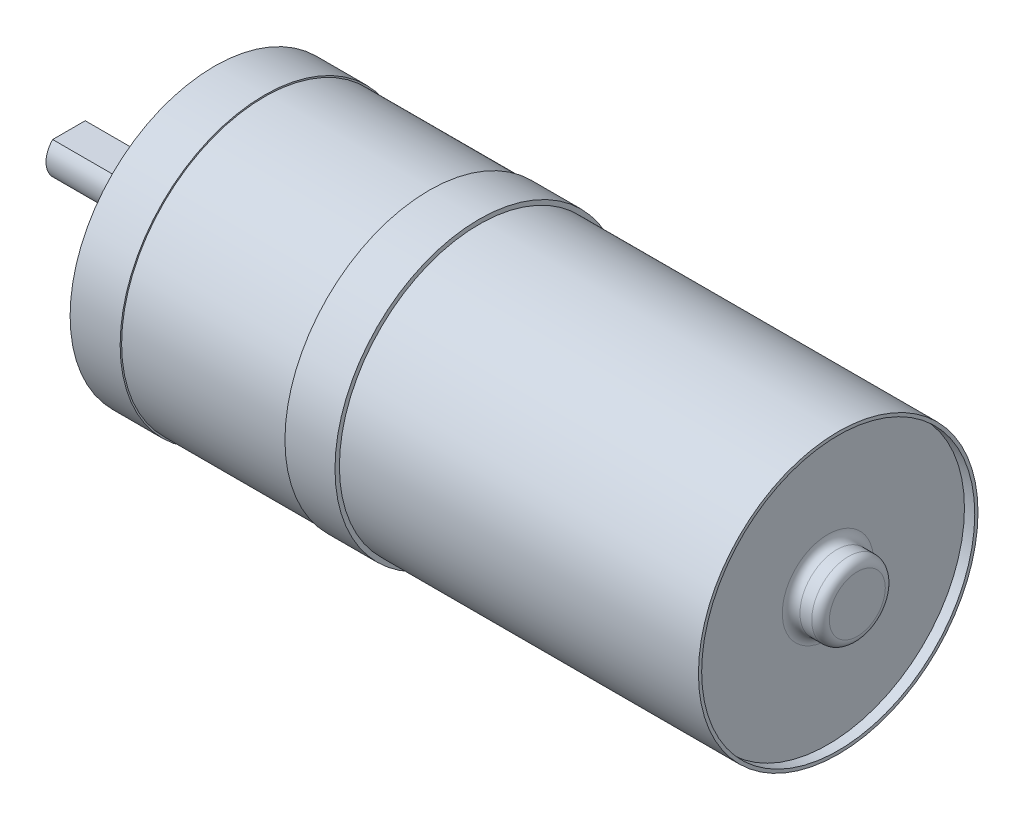
ISO-10303-21;
HEADER;
FILE_DESCRIPTION(('STEP AP214'),'2;1');
FILE_NAME('part.step','',(''),(''),'','','');
FILE_SCHEMA(('AUTOMOTIVE_DESIGN { 1 0 10303 214 1 1 1 1 }'));
ENDSEC;
DATA;
#1=APPLICATION_CONTEXT('core data for automotive mechanical design processes');
#2=APPLICATION_PROTOCOL_DEFINITION('international standard','automotive_design',2000,#1);
#3=PRODUCT_CONTEXT('',#1,'mechanical');
#4=PRODUCT('Part','Part','',(#3));
#5=PRODUCT_RELATED_PRODUCT_CATEGORY('part','',(#4));
#6=PRODUCT_DEFINITION_FORMATION('','',#4);
#7=PRODUCT_DEFINITION_CONTEXT('part definition',#1,'design');
#8=PRODUCT_DEFINITION('design','',#6,#7);
#9=PRODUCT_DEFINITION_SHAPE('','',#8);
#10=(LENGTH_UNIT() NAMED_UNIT(*) SI_UNIT(.MILLI.,.METRE.));
#11=(NAMED_UNIT(*) PLANE_ANGLE_UNIT() SI_UNIT($,.RADIAN.));
#12=(NAMED_UNIT(*) SI_UNIT($,.STERADIAN.) SOLID_ANGLE_UNIT());
#13=UNCERTAINTY_MEASURE_WITH_UNIT(LENGTH_MEASURE(1.E-05),#10,'distance_accuracy_value','');
#14=(GEOMETRIC_REPRESENTATION_CONTEXT(3) GLOBAL_UNCERTAINTY_ASSIGNED_CONTEXT((#13)) GLOBAL_UNIT_ASSIGNED_CONTEXT((#10,
#11,#12)) REPRESENTATION_CONTEXT('',''));
#15=CARTESIAN_POINT('',(0.,0.,0.));
#16=DIRECTION('',(0.,0.,1.));
#17=DIRECTION('',(1.,0.,0.));
#18=AXIS2_PLACEMENT_3D('',#15,#16,#17);
#19=CARTESIAN_POINT('',(30.099,0.,0.));
#20=DIRECTION('',(1.,0.,0.));
#21=DIRECTION('',(0.,0.,-1.));
#22=AXIS2_PLACEMENT_3D('',#19,#20,#21);
#23=PLANE('',#22);
#24=CARTESIAN_POINT('',(30.099,0.,0.));
#25=DIRECTION('',(1.,0.,0.));
#26=DIRECTION('',(0.,0.,-1.));
#27=AXIS2_PLACEMENT_3D('',#24,#25,#26);
#28=CIRCLE('',#27,3.937);
#29=CARTESIAN_POINT('',(30.099,0.,-3.937));
#30=VERTEX_POINT('',#29);
#31=EDGE_CURVE('E44',#30,#30,#28,.F.);
#32=ORIENTED_EDGE('',*,*,#31,.T.);
#33=EDGE_LOOP('',(#32));
#34=FACE_BOUND('',#33,.T.);
#35=CARTESIAN_POINT('',(30.099,0.,0.));
#36=DIRECTION('',(1.,0.,0.));
#37=DIRECTION('',(0.,0.,-1.));
#38=AXIS2_PLACEMENT_3D('',#35,#36,#37);
#39=CIRCLE('',#38,11.7856);
#40=CARTESIAN_POINT('',(30.099,0.,-11.7856));
#41=VERTEX_POINT('',#40);
#42=EDGE_CURVE('E68',#41,#41,#39,.T.);
#43=ORIENTED_EDGE('',*,*,#42,.T.);
#44=EDGE_LOOP('',(#43));
#45=FACE_BOUND('',#44,.T.);
#46=ADVANCED_FACE('F36',(#34,#45),#23,.T.);
#47=CARTESIAN_POINT('',(-25.4,0.,0.));
#48=DIRECTION('',(-1.,0.,0.));
#49=DIRECTION('',(0.,0.,1.));
#50=AXIS2_PLACEMENT_3D('',#47,#48,#49);
#51=PLANE('',#50);
#52=CARTESIAN_POINT('',(-25.4,0.,0.));
#53=DIRECTION('',(-1.,0.,0.));
#54=DIRECTION('',(0.,0.,1.));
#55=AXIS2_PLACEMENT_3D('',#52,#53,#54);
#56=CIRCLE('',#55,3.5052);
#57=CARTESIAN_POINT('',(-25.4,0.,3.5052));
#58=VERTEX_POINT('',#57);
#59=EDGE_CURVE('E81',#58,#58,#56,.T.);
#60=ORIENTED_EDGE('',*,*,#59,.T.);
#61=EDGE_LOOP('',(#60));
#62=FACE_BOUND('',#61,.T.);
#63=CARTESIAN_POINT('',(-25.4,0.,0.));
#64=DIRECTION('',(-1.,0.,0.));
#65=DIRECTION('',(0.,0.,1.));
#66=AXIS2_PLACEMENT_3D('',#63,#64,#65);
#67=CIRCLE('',#66,1.9812);
#68=CARTESIAN_POINT('',(-25.4,0.,1.9812));
#69=VERTEX_POINT('',#68);
#70=EDGE_CURVE('E75',#69,#69,#67,.T.);
#71=ORIENTED_EDGE('',*,*,#70,.F.);
#72=EDGE_LOOP('',(#71));
#73=FACE_BOUND('',#72,.T.);
#74=ADVANCED_FACE('F147',(#62,#73),#51,.T.);
#75=CARTESIAN_POINT('',(-22.86,0.,0.));
#76=DIRECTION('',(-1.,0.,0.));
#77=DIRECTION('',(0.,0.,1.));
#78=AXIS2_PLACEMENT_3D('',#75,#76,#77);
#79=PLANE('',#78);
#80=CARTESIAN_POINT('',(-22.86,0.,-8.509));
#81=DIRECTION('',(-1.,0.,0.));
#82=DIRECTION('',(0.,0.,1.));
#83=AXIS2_PLACEMENT_3D('',#80,#81,#82);
#84=CIRCLE('',#83,1.397);
#85=CARTESIAN_POINT('',(-22.86,0.,-7.112));
#86=VERTEX_POINT('',#85);
#87=EDGE_CURVE('E342',#86,#86,#84,.T.);
#88=ORIENTED_EDGE('',*,*,#87,.F.);
#89=EDGE_LOOP('',(#88));
#90=FACE_BOUND('',#89,.T.);
#91=CARTESIAN_POINT('',(-22.86,0.,8.509));
#92=DIRECTION('',(-1.,0.,0.));
#93=DIRECTION('',(0.,0.,1.));
#94=AXIS2_PLACEMENT_3D('',#91,#92,#93);
#95=CIRCLE('',#94,1.397);
#96=CARTESIAN_POINT('',(-22.86,0.,9.906));
#97=VERTEX_POINT('',#96);
#98=EDGE_CURVE('E341',#97,#97,#95,.T.);
#99=ORIENTED_EDGE('',*,*,#98,.F.);
#100=EDGE_LOOP('',(#99));
#101=FACE_BOUND('',#100,.T.);
#102=CARTESIAN_POINT('',(-22.86,0.,0.));
#103=DIRECTION('',(-1.,0.,0.));
#104=DIRECTION('',(0.,0.,1.));
#105=AXIS2_PLACEMENT_3D('',#102,#103,#104);
#106=CIRCLE('',#105,12.446);
#107=CARTESIAN_POINT('',(-22.86,0.,12.446));
#108=VERTEX_POINT('',#107);
#109=EDGE_CURVE('E90',#108,#108,#106,.T.);
#110=ORIENTED_EDGE('',*,*,#109,.T.);
#111=EDGE_LOOP('',(#110));
#112=FACE_BOUND('',#111,.T.);
#113=CARTESIAN_POINT('',(-22.86,0.,0.));
#114=DIRECTION('',(-1.,0.,0.));
#115=DIRECTION('',(0.,0.,1.));
#116=AXIS2_PLACEMENT_3D('',#113,#114,#115);
#117=CIRCLE('',#116,3.5052);
#118=CARTESIAN_POINT('',(-22.86,0.,3.5052));
#119=VERTEX_POINT('',#118);
#120=EDGE_CURVE('E78',#119,#119,#117,.T.);
#121=ORIENTED_EDGE('',*,*,#120,.F.);
#122=EDGE_LOOP('',(#121));
#123=FACE_BOUND('',#122,.T.);
#124=ADVANCED_FACE('F152',(#90,#101,#112,#123),#79,.T.);
#125=CARTESIAN_POINT('',(-4.318,0.,0.));
#126=DIRECTION('',(-1.,0.,0.));
#127=DIRECTION('',(0.,0.,1.));
#128=AXIS2_PLACEMENT_3D('',#125,#126,#127);
#129=PLANE('',#128);
#130=CARTESIAN_POINT('',(-4.318,0.,0.));
#131=DIRECTION('',(-1.,0.,0.));
#132=DIRECTION('',(0.,0.,1.));
#133=AXIS2_PLACEMENT_3D('',#130,#131,#132);
#134=CIRCLE('',#133,12.446);
#135=CARTESIAN_POINT('',(-4.318,0.,12.446));
#136=VERTEX_POINT('',#135);
#137=EDGE_CURVE('E102',#136,#136,#134,.T.);
#138=ORIENTED_EDGE('',*,*,#137,.T.);
#139=EDGE_LOOP('',(#138));
#140=FACE_BOUND('',#139,.T.);
#141=CARTESIAN_POINT('',(-4.318,0.,0.));
#142=DIRECTION('',(-1.,0.,0.));
#143=DIRECTION('',(0.,0.,1.));
#144=AXIS2_PLACEMENT_3D('',#141,#142,#143);
#145=CIRCLE('',#144,12.319);
#146=CARTESIAN_POINT('',(-4.318,0.,12.319));
#147=VERTEX_POINT('',#146);
#148=EDGE_CURVE('E93',#147,#147,#145,.T.);
#149=ORIENTED_EDGE('',*,*,#148,.F.);
#150=EDGE_LOOP('',(#149));
#151=FACE_BOUND('',#150,.T.);
#152=ADVANCED_FACE('F176',(#140,#151),#129,.T.);
#153=CARTESIAN_POINT('',(30.988,0.,0.));
#154=DIRECTION('',(-1.,0.,0.));
#155=DIRECTION('',(0.,0.,1.));
#156=AXIS2_PLACEMENT_3D('',#153,#154,#155);
#157=CYLINDRICAL_SURFACE('',#156,12.065);
#158=CARTESIAN_POINT('',(30.988,0.,0.));
#159=DIRECTION('',(1.,0.,0.));
#160=DIRECTION('',(0.,0.,-1.));
#161=AXIS2_PLACEMENT_3D('',#158,#159,#160);
#162=CIRCLE('',#161,12.065);
#163=CARTESIAN_POINT('',(30.988,0.,-12.065));
#164=VERTEX_POINT('',#163);
#165=EDGE_CURVE('E110',#164,#164,#162,.T.);
#166=ORIENTED_EDGE('',*,*,#165,.F.);
#167=EDGE_LOOP('',(#166));
#168=FACE_BOUND('',#167,.T.);
#169=CARTESIAN_POINT('',(0.,0.,0.));
#170=DIRECTION('',(-1.,0.,0.));
#171=DIRECTION('',(0.,0.,1.));
#172=AXIS2_PLACEMENT_3D('',#169,#170,#171);
#173=CIRCLE('',#172,12.065);
#174=CARTESIAN_POINT('',(0.,0.,12.065));
#175=VERTEX_POINT('',#174);
#176=EDGE_CURVE('E105',#175,#175,#173,.T.);
#177=ORIENTED_EDGE('',*,*,#176,.F.);
#178=EDGE_LOOP('',(#177));
#179=FACE_BOUND('',#178,.T.);
#180=ADVANCED_FACE('F192',(#168,#179),#157,.T.);
#181=CARTESIAN_POINT('',(30.988,0.,0.));
#182=DIRECTION('',(1.,0.,0.));
#183=DIRECTION('',(0.,0.,-1.));
#184=AXIS2_PLACEMENT_3D('',#181,#182,#183);
#185=PLANE('',#184);
#186=CARTESIAN_POINT('',(30.988,0.,0.));
#187=DIRECTION('',(1.,0.,0.));
#188=DIRECTION('',(0.,0.,-1.));
#189=AXIS2_PLACEMENT_3D('',#186,#187,#188);
#190=CIRCLE('',#189,11.7856);
#191=CARTESIAN_POINT('',(30.988,0.,-11.7856));
#192=VERTEX_POINT('',#191);
#193=EDGE_CURVE('E351',#192,#192,#190,.T.);
#194=ORIENTED_EDGE('',*,*,#193,.F.);
#195=EDGE_LOOP('',(#194));
#196=FACE_BOUND('',#195,.T.);
#197=ORIENTED_EDGE('',*,*,#165,.T.);
#198=EDGE_LOOP('',(#197));
#199=FACE_BOUND('',#198,.T.);
#200=ADVANCED_FACE('F197',(#196,#199),#185,.T.);
#201=CARTESIAN_POINT('',(0.,0.,0.));
#202=DIRECTION('',(-1.,0.,0.));
#203=DIRECTION('',(0.,0.,1.));
#204=AXIS2_PLACEMENT_3D('',#201,#202,#203);
#205=PLANE('',#204);
#206=CARTESIAN_POINT('',(0.,0.,0.));
#207=DIRECTION('',(-1.,0.,0.));
#208=DIRECTION('',(0.,0.,1.));
#209=AXIS2_PLACEMENT_3D('',#206,#207,#208);
#210=CIRCLE('',#209,12.446);
#211=CARTESIAN_POINT('',(0.,0.,12.446));
#212=VERTEX_POINT('',#211);
#213=EDGE_CURVE('E99',#212,#212,#210,.T.);
#214=ORIENTED_EDGE('',*,*,#213,.F.);
#215=EDGE_LOOP('',(#214));
#216=FACE_BOUND('',#215,.T.);
#217=ORIENTED_EDGE('',*,*,#176,.T.);
#218=EDGE_LOOP('',(#217));
#219=FACE_BOUND('',#218,.T.);
#220=ADVANCED_FACE('F194',(#216,#219),#205,.F.);
#221=CARTESIAN_POINT('',(-4.318,0.,0.));
#222=DIRECTION('',(1.,0.,0.));
#223=DIRECTION('',(0.,0.,-1.));
#224=AXIS2_PLACEMENT_3D('',#221,#222,#223);
#225=CYLINDRICAL_SURFACE('',#224,12.446);
#226=ORIENTED_EDGE('',*,*,#137,.F.);
#227=EDGE_LOOP('',(#226));
#228=FACE_BOUND('',#227,.T.);
#229=ORIENTED_EDGE('',*,*,#213,.T.);
#230=EDGE_LOOP('',(#229));
#231=FACE_BOUND('',#230,.T.);
#232=ADVANCED_FACE('F188',(#228,#231),#225,.T.);
#233=CARTESIAN_POINT('',(-18.542,0.,0.));
#234=DIRECTION('',(1.,0.,0.));
#235=DIRECTION('',(0.,0.,-1.));
#236=AXIS2_PLACEMENT_3D('',#233,#234,#235);
#237=CYLINDRICAL_SURFACE('',#236,12.319);
#238=CARTESIAN_POINT('',(-18.542,0.,0.));
#239=DIRECTION('',(-1.,0.,0.));
#240=DIRECTION('',(0.,0.,1.));
#241=AXIS2_PLACEMENT_3D('',#238,#239,#240);
#242=CIRCLE('',#241,12.319);
#243=CARTESIAN_POINT('',(-18.542,0.,12.319));
#244=VERTEX_POINT('',#243);
#245=EDGE_CURVE('E96',#244,#244,#242,.T.);
#246=ORIENTED_EDGE('',*,*,#245,.F.);
#247=EDGE_LOOP('',(#246));
#248=FACE_BOUND('',#247,.T.);
#249=ORIENTED_EDGE('',*,*,#148,.T.);
#250=EDGE_LOOP('',(#249));
#251=FACE_BOUND('',#250,.T.);
#252=ADVANCED_FACE('F181',(#248,#251),#237,.T.);
#253=CARTESIAN_POINT('',(-18.542,0.,0.));
#254=DIRECTION('',(-1.,0.,0.));
#255=DIRECTION('',(0.,0.,1.));
#256=AXIS2_PLACEMENT_3D('',#253,#254,#255);
#257=PLANE('',#256);
#258=CARTESIAN_POINT('',(-18.542,0.,0.));
#259=DIRECTION('',(-1.,0.,0.));
#260=DIRECTION('',(0.,0.,1.));
#261=AXIS2_PLACEMENT_3D('',#258,#259,#260);
#262=CIRCLE('',#261,12.446);
#263=CARTESIAN_POINT('',(-18.542,0.,12.446));
#264=VERTEX_POINT('',#263);
#265=EDGE_CURVE('E88',#264,#264,#262,.T.);
#266=ORIENTED_EDGE('',*,*,#265,.F.);
#267=EDGE_LOOP('',(#266));
#268=FACE_BOUND('',#267,.T.);
#269=ORIENTED_EDGE('',*,*,#245,.T.);
#270=EDGE_LOOP('',(#269));
#271=FACE_BOUND('',#270,.T.);
#272=ADVANCED_FACE('F178',(#268,#271),#257,.F.);
#273=CARTESIAN_POINT('',(-22.86,0.,0.));
#274=DIRECTION('',(1.,0.,0.));
#275=DIRECTION('',(0.,0.,-1.));
#276=AXIS2_PLACEMENT_3D('',#273,#274,#275);
#277=CYLINDRICAL_SURFACE('',#276,12.446);
#278=ORIENTED_EDGE('',*,*,#109,.F.);
#279=EDGE_LOOP('',(#278));
#280=FACE_BOUND('',#279,.T.);
#281=ORIENTED_EDGE('',*,*,#265,.T.);
#282=EDGE_LOOP('',(#281));
#283=FACE_BOUND('',#282,.T.);
#284=ADVANCED_FACE('F172',(#280,#283),#277,.T.);
#285=CARTESIAN_POINT('',(-25.4,0.,0.));
#286=DIRECTION('',(1.,0.,0.));
#287=DIRECTION('',(0.,0.,-1.));
#288=AXIS2_PLACEMENT_3D('',#285,#286,#287);
#289=CYLINDRICAL_SURFACE('',#288,3.5052);
#290=ORIENTED_EDGE('',*,*,#59,.F.);
#291=EDGE_LOOP('',(#290));
#292=FACE_BOUND('',#291,.T.);
#293=ORIENTED_EDGE('',*,*,#120,.T.);
#294=EDGE_LOOP('',(#293));
#295=FACE_BOUND('',#294,.T.);
#296=ADVANCED_FACE('F168',(#292,#295),#289,.T.);
#297=CARTESIAN_POINT('',(-35.4076,0.,0.));
#298=DIRECTION('',(1.,0.,0.));
#299=DIRECTION('',(0.,0.,-1.));
#300=AXIS2_PLACEMENT_3D('',#297,#298,#299);
#301=CYLINDRICAL_SURFACE('',#300,1.9812);
#302=CARTESIAN_POINT('',(-35.4076,0.,0.));
#303=DIRECTION('',(-1.,0.,0.));
#304=DIRECTION('',(0.,0.,1.));
#305=AXIS2_PLACEMENT_3D('',#302,#303,#304);
#306=CIRCLE('',#305,1.9812);
#307=CARTESIAN_POINT('',(-35.4076,1.397,-1.40482897179692));
#308=VERTEX_POINT('',#307);
#309=CARTESIAN_POINT('',(-35.4076,1.397,1.40482897179692));
#310=VERTEX_POINT('',#309);
#311=EDGE_CURVE('E74',#308,#310,#306,.T.);
#312=ORIENTED_EDGE('',*,*,#311,.F.);
#313=DIRECTION('',(-1.,0.,0.));
#314=VECTOR('',#313,1.);
#315=CARTESIAN_POINT('',(-27.4828,1.397,-1.40482897179692));
#316=LINE('',#315,#314);
#317=CARTESIAN_POINT('',(-27.4828,1.397,-1.40482897179692));
#318=VERTEX_POINT('',#317);
#319=EDGE_CURVE('E51',#318,#308,#316,.T.);
#320=ORIENTED_EDGE('',*,*,#319,.F.);
#321=CARTESIAN_POINT('',(-27.4828,0.,0.));
#322=DIRECTION('',(-1.,0.,0.));
#323=DIRECTION('',(0.,0.,1.));
#324=AXIS2_PLACEMENT_3D('',#321,#322,#323);
#325=CIRCLE('',#324,1.9812);
#326=CARTESIAN_POINT('',(-27.4828,1.397,1.40482897179692));
#327=VERTEX_POINT('',#326);
#328=EDGE_CURVE('E67',#327,#318,#325,.T.);
#329=ORIENTED_EDGE('',*,*,#328,.F.);
#330=DIRECTION('',(-1.,0.,0.));
#331=VECTOR('',#330,1.);
#332=CARTESIAN_POINT('',(-27.4828,1.397,1.40482897179692));
#333=LINE('',#332,#331);
#334=EDGE_CURVE('E57',#327,#310,#333,.T.);
#335=ORIENTED_EDGE('',*,*,#334,.T.);
#336=EDGE_LOOP('',(#312,#320,#329,#335));
#337=FACE_BOUND('',#336,.T.);
#338=ORIENTED_EDGE('',*,*,#70,.T.);
#339=EDGE_LOOP('',(#338));
#340=FACE_BOUND('',#339,.T.);
#341=ADVANCED_FACE('F72',(#337,#340),#301,.T.);
#342=CARTESIAN_POINT('',(-35.4076,0.,0.));
#343=DIRECTION('',(-1.,0.,0.));
#344=DIRECTION('',(0.,0.,1.));
#345=AXIS2_PLACEMENT_3D('',#342,#343,#344);
#346=PLANE('',#345);
#347=DIRECTION('',(0.,0.,1.));
#348=VECTOR('',#347,1.);
#349=CARTESIAN_POINT('',(-35.4076,1.397,-1.40482897179692));
#350=LINE('',#349,#348);
#351=EDGE_CURVE('E62',#308,#310,#350,.T.);
#352=ORIENTED_EDGE('',*,*,#351,.F.);
#353=ORIENTED_EDGE('',*,*,#311,.T.);
#354=EDGE_LOOP('',(#352,#353));
#355=FACE_BOUND('',#354,.T.);
#356=ADVANCED_FACE('F77',(#355),#346,.T.);
#357=CARTESIAN_POINT('',(-27.4828,1.397,-1.40482897179692));
#358=DIRECTION('',(0.,-1.,0.));
#359=DIRECTION('',(0.,0.,-1.));
#360=AXIS2_PLACEMENT_3D('',#357,#358,#359);
#361=PLANE('',#360);
#362=ORIENTED_EDGE('',*,*,#351,.T.);
#363=ORIENTED_EDGE('',*,*,#334,.F.);
#364=DIRECTION('',(0.,0.,1.));
#365=VECTOR('',#364,1.);
#366=CARTESIAN_POINT('',(-27.4828,1.397,-1.40482897179692));
#367=LINE('',#366,#365);
#368=EDGE_CURVE('E358',#318,#327,#367,.T.);
#369=ORIENTED_EDGE('',*,*,#368,.F.);
#370=ORIENTED_EDGE('',*,*,#319,.T.);
#371=EDGE_LOOP('',(#362,#363,#369,#370));
#372=FACE_BOUND('',#371,.T.);
#373=ADVANCED_FACE('F63',(#372),#361,.F.);
#374=CARTESIAN_POINT('',(-27.4828,0.,0.));
#375=DIRECTION('',(-1.,0.,0.));
#376=DIRECTION('',(0.,0.,1.));
#377=AXIS2_PLACEMENT_3D('',#374,#375,#376);
#378=PLANE('',#377);
#379=ORIENTED_EDGE('',*,*,#328,.T.);
#380=ORIENTED_EDGE('',*,*,#368,.T.);
#381=EDGE_LOOP('',(#379,#380));
#382=FACE_BOUND('',#381,.T.);
#383=ADVANCED_FACE('F158',(#382),#378,.T.);
#384=CARTESIAN_POINT('',(30.099,0.,0.));
#385=DIRECTION('',(1.,0.,0.));
#386=DIRECTION('',(0.,0.,-1.));
#387=AXIS2_PLACEMENT_3D('',#384,#385,#386);
#388=CYLINDRICAL_SURFACE('',#387,11.7856);
#389=ORIENTED_EDGE('',*,*,#42,.F.);
#390=EDGE_LOOP('',(#389));
#391=FACE_BOUND('',#390,.T.);
#392=ORIENTED_EDGE('',*,*,#193,.T.);
#393=EDGE_LOOP('',(#392));
#394=FACE_BOUND('',#393,.T.);
#395=ADVANCED_FACE('F132',(#391,#394),#388,.F.);
#396=CARTESIAN_POINT('',(32.639,0.,0.));
#397=DIRECTION('',(-1.,0.,0.));
#398=DIRECTION('',(0.,0.,1.));
#399=AXIS2_PLACEMENT_3D('',#396,#397,#398);
#400=CYLINDRICAL_SURFACE('',#399,3.175);
#401=CARTESIAN_POINT('',(30.861,0.,0.));
#402=DIRECTION('',(1.,0.,0.));
#403=DIRECTION('',(0.,0.,-1.));
#404=AXIS2_PLACEMENT_3D('',#401,#402,#403);
#405=CIRCLE('',#404,3.175);
#406=CARTESIAN_POINT('',(30.861,0.,-3.175));
#407=VERTEX_POINT('',#406);
#408=EDGE_CURVE('E116',#407,#407,#405,.T.);
#409=ORIENTED_EDGE('',*,*,#408,.T.);
#410=EDGE_LOOP('',(#409));
#411=FACE_BOUND('',#410,.T.);
#412=CARTESIAN_POINT('',(31.877,0.,0.));
#413=DIRECTION('',(1.,0.,0.));
#414=DIRECTION('',(0.,0.,-1.));
#415=AXIS2_PLACEMENT_3D('',#412,#413,#414);
#416=CIRCLE('',#415,3.175);
#417=CARTESIAN_POINT('',(31.877,0.,-3.175));
#418=VERTEX_POINT('',#417);
#419=EDGE_CURVE('E113',#418,#418,#416,.F.);
#420=ORIENTED_EDGE('',*,*,#419,.T.);
#421=EDGE_LOOP('',(#420));
#422=FACE_BOUND('',#421,.T.);
#423=ADVANCED_FACE('F129',(#411,#422),#400,.T.);
#424=CARTESIAN_POINT('',(32.639,0.,0.));
#425=DIRECTION('',(1.,0.,0.));
#426=DIRECTION('',(0.,0.,-1.));
#427=AXIS2_PLACEMENT_3D('',#424,#425,#426);
#428=PLANE('',#427);
#429=CARTESIAN_POINT('',(32.639,0.,0.));
#430=DIRECTION('',(1.,0.,0.));
#431=DIRECTION('',(0.,0.,-1.));
#432=AXIS2_PLACEMENT_3D('',#429,#430,#431);
#433=CIRCLE('',#432,2.413);
#434=CARTESIAN_POINT('',(32.639,0.,-2.413));
#435=VERTEX_POINT('',#434);
#436=EDGE_CURVE('E11',#435,#435,#433,.T.);
#437=ORIENTED_EDGE('',*,*,#436,.T.);
#438=EDGE_LOOP('',(#437));
#439=FACE_BOUND('',#438,.T.);
#440=ADVANCED_FACE('F126',(#439),#428,.T.);
#441=CARTESIAN_POINT('',(30.861,0.,0.));
#442=DIRECTION('',(1.,0.,0.));
#443=DIRECTION('',(0.,0.,-1.));
#444=AXIS2_PLACEMENT_3D('',#441,#442,#443);
#445=TOROIDAL_SURFACE('',#444,3.937,0.762);
#446=ORIENTED_EDGE('',*,*,#31,.F.);
#447=EDGE_LOOP('',(#446));
#448=FACE_BOUND('',#447,.T.);
#449=ORIENTED_EDGE('',*,*,#408,.F.);
#450=EDGE_LOOP('',(#449));
#451=FACE_BOUND('',#450,.T.);
#452=ADVANCED_FACE('F123',(#448,#451),#445,.F.);
#453=CARTESIAN_POINT('',(31.877,0.,0.));
#454=DIRECTION('',(1.,0.,0.));
#455=DIRECTION('',(0.,0.,-1.));
#456=AXIS2_PLACEMENT_3D('',#453,#454,#455);
#457=TOROIDAL_SURFACE('',#456,2.413,0.762);
#458=ORIENTED_EDGE('',*,*,#419,.F.);
#459=EDGE_LOOP('',(#458));
#460=FACE_BOUND('',#459,.T.);
#461=ORIENTED_EDGE('',*,*,#436,.F.);
#462=EDGE_LOOP('',(#461));
#463=FACE_BOUND('',#462,.T.);
#464=ADVANCED_FACE('F38',(#460,#463),#457,.T.);
#465=CARTESIAN_POINT('',(-18.1102,0.,8.509));
#466=DIRECTION('',(-1.,0.,0.));
#467=DIRECTION('',(0.,0.,1.));
#468=AXIS2_PLACEMENT_3D('',#465,#466,#467);
#469=CYLINDRICAL_SURFACE('',#468,1.397);
#470=CARTESIAN_POINT('',(-18.1102,0.,8.509));
#471=DIRECTION('',(-1.,0.,0.));
#472=DIRECTION('',(0.,0.,1.));
#473=AXIS2_PLACEMENT_3D('',#470,#471,#472);
#474=CIRCLE('',#473,1.397);
#475=CARTESIAN_POINT('',(-18.1102,0.,9.906));
#476=VERTEX_POINT('',#475);
#477=EDGE_CURVE('E345',#476,#476,#474,.T.);
#478=ORIENTED_EDGE('',*,*,#477,.F.);
#479=EDGE_LOOP('',(#478));
#480=FACE_BOUND('',#479,.T.);
#481=ORIENTED_EDGE('',*,*,#98,.T.);
#482=EDGE_LOOP('',(#481));
#483=FACE_BOUND('',#482,.T.);
#484=ADVANCED_FACE('F138',(#480,#483),#469,.F.);
#485=CARTESIAN_POINT('',(-18.1102,0.,8.509));
#486=DIRECTION('',(-1.,0.,0.));
#487=DIRECTION('',(0.,0.,1.));
#488=AXIS2_PLACEMENT_3D('',#485,#486,#487);
#489=PLANE('',#488);
#490=ORIENTED_EDGE('',*,*,#477,.T.);
#491=EDGE_LOOP('',(#490));
#492=FACE_BOUND('',#491,.T.);
#493=ADVANCED_FACE('F303',(#492),#489,.T.);
#494=CARTESIAN_POINT('',(-18.1102,0.,-8.509));
#495=DIRECTION('',(-1.,0.,0.));
#496=DIRECTION('',(0.,0.,1.));
#497=AXIS2_PLACEMENT_3D('',#494,#495,#496);
#498=CYLINDRICAL_SURFACE('',#497,1.397);
#499=CARTESIAN_POINT('',(-18.1102,0.,-8.509));
#500=DIRECTION('',(-1.,0.,0.));
#501=DIRECTION('',(0.,0.,1.));
#502=AXIS2_PLACEMENT_3D('',#499,#500,#501);
#503=CIRCLE('',#502,1.397);
#504=CARTESIAN_POINT('',(-18.1102,0.,-7.112));
#505=VERTEX_POINT('',#504);
#506=EDGE_CURVE('E340',#505,#505,#503,.T.);
#507=ORIENTED_EDGE('',*,*,#506,.F.);
#508=EDGE_LOOP('',(#507));
#509=FACE_BOUND('',#508,.T.);
#510=ORIENTED_EDGE('',*,*,#87,.T.);
#511=EDGE_LOOP('',(#510));
#512=FACE_BOUND('',#511,.T.);
#513=ADVANCED_FACE('F313',(#509,#512),#498,.F.);
#514=CARTESIAN_POINT('',(-18.1102,0.,-8.509));
#515=DIRECTION('',(-1.,0.,0.));
#516=DIRECTION('',(0.,0.,1.));
#517=AXIS2_PLACEMENT_3D('',#514,#515,#516);
#518=PLANE('',#517);
#519=ORIENTED_EDGE('',*,*,#506,.T.);
#520=EDGE_LOOP('',(#519));
#521=FACE_BOUND('',#520,.T.);
#522=ADVANCED_FACE('F323',(#521),#518,.T.);
#523=CLOSED_SHELL('',(#46,#74,#124,#152,#180,#200,#220,#232,#252,#272,#284,#296,#341,#356,#373,
#383,#395,#423,#440,#452,#464,#484,#493,#513,#522));
#524=MANIFOLD_SOLID_BREP('B2',#523);
#525=ADVANCED_BREP_SHAPE_REPRESENTATION('',(#18,#524),#14);
#526=SHAPE_DEFINITION_REPRESENTATION(#9,#525);
ENDSEC;
END-ISO-10303-21;
